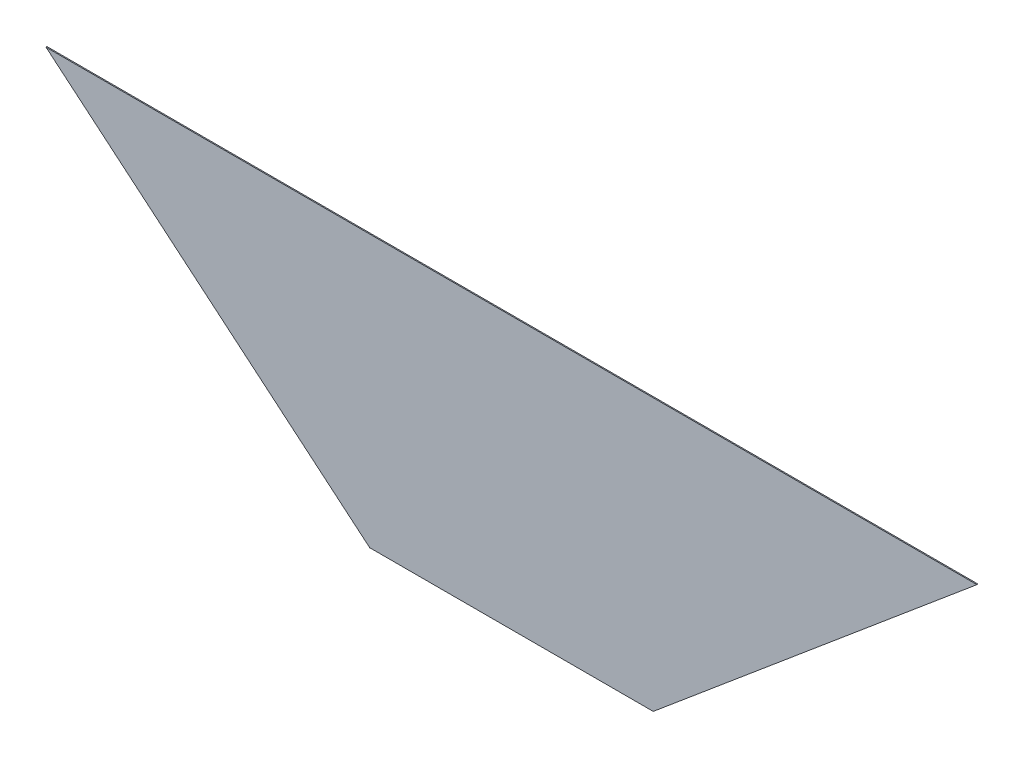
ISO-10303-21;
HEADER;
FILE_DESCRIPTION(('STEP AP214'),'2;1');
FILE_NAME('part.step','',(''),(''),'','','');
FILE_SCHEMA(('AUTOMOTIVE_DESIGN { 1 0 10303 214 1 1 1 1 }'));
ENDSEC;
DATA;
#1=APPLICATION_CONTEXT('core data for automotive mechanical design processes');
#2=APPLICATION_PROTOCOL_DEFINITION('international standard','automotive_design',2000,#1);
#3=PRODUCT_CONTEXT('',#1,'mechanical');
#4=PRODUCT('Part','Part','',(#3));
#5=PRODUCT_RELATED_PRODUCT_CATEGORY('part','',(#4));
#6=PRODUCT_DEFINITION_FORMATION('','',#4);
#7=PRODUCT_DEFINITION_CONTEXT('part definition',#1,'design');
#8=PRODUCT_DEFINITION('design','',#6,#7);
#9=PRODUCT_DEFINITION_SHAPE('','',#8);
#10=(LENGTH_UNIT() NAMED_UNIT(*) SI_UNIT(.MILLI.,.METRE.));
#11=(NAMED_UNIT(*) PLANE_ANGLE_UNIT() SI_UNIT($,.RADIAN.));
#12=(NAMED_UNIT(*) SI_UNIT($,.STERADIAN.) SOLID_ANGLE_UNIT());
#13=UNCERTAINTY_MEASURE_WITH_UNIT(LENGTH_MEASURE(1.E-05),#10,'distance_accuracy_value','');
#14=(GEOMETRIC_REPRESENTATION_CONTEXT(3) GLOBAL_UNCERTAINTY_ASSIGNED_CONTEXT((#13)) GLOBAL_UNIT_ASSIGNED_CONTEXT((#10,
#11,#12)) REPRESENTATION_CONTEXT('',''));
#15=CARTESIAN_POINT('',(0.,0.,0.));
#16=DIRECTION('',(0.,0.,1.));
#17=DIRECTION('',(1.,0.,0.));
#18=AXIS2_PLACEMENT_3D('',#15,#16,#17);
#19=CARTESIAN_POINT('',(0.,0.,2.9));
#20=DIRECTION('',(0.642787609686535,0.766044443118982,0.));
#21=DIRECTION('',(-0.766044443118982,0.642787609686535,0.));
#22=AXIS2_PLACEMENT_3D('',#19,#20,#21);
#23=PLANE('',#22);
#24=DIRECTION('',(0.766044443118982,-0.642787609686535,0.));
#25=VECTOR('',#24,1.);
#26=CARTESIAN_POINT('',(0.,0.,0.));
#27=LINE('',#26,#25);
#28=CARTESIAN_POINT('',(-903.122790003829,757.81,0.));
#29=VERTEX_POINT('',#28);
#30=CARTESIAN_POINT('',(0.,0.,0.));
#31=VERTEX_POINT('',#30);
#32=EDGE_CURVE('E99',#29,#31,#27,.T.);
#33=ORIENTED_EDGE('',*,*,#32,.T.);
#34=DIRECTION('',(0.,0.,-1.));
#35=VECTOR('',#34,1.);
#36=CARTESIAN_POINT('',(0.,0.,2.9));
#37=LINE('',#36,#35);
#38=CARTESIAN_POINT('',(0.,0.,2.9));
#39=VERTEX_POINT('',#38);
#40=EDGE_CURVE('E11',#39,#31,#37,.T.);
#41=ORIENTED_EDGE('',*,*,#40,.F.);
#42=DIRECTION('',(0.766044443118982,-0.642787609686535,0.));
#43=VECTOR('',#42,1.);
#44=CARTESIAN_POINT('',(0.,0.,2.9));
#45=LINE('',#44,#43);
#46=CARTESIAN_POINT('',(-903.122790003829,757.81,2.9));
#47=VERTEX_POINT('',#46);
#48=EDGE_CURVE('E85',#47,#39,#45,.T.);
#49=ORIENTED_EDGE('',*,*,#48,.F.);
#50=DIRECTION('',(0.,0.,-1.));
#51=VECTOR('',#50,1.);
#52=CARTESIAN_POINT('',(-903.122790003829,757.81,2.9));
#53=LINE('',#52,#51);
#54=EDGE_CURVE('E95',#47,#29,#53,.T.);
#55=ORIENTED_EDGE('',*,*,#54,.T.);
#56=EDGE_LOOP('',(#33,#41,#49,#55));
#57=FACE_BOUND('',#56,.T.);
#58=ADVANCED_FACE('F35',(#57),#23,.F.);
#59=CARTESIAN_POINT('',(0.,0.,2.9));
#60=DIRECTION('',(0.,1.,0.));
#61=DIRECTION('',(0.,0.,1.));
#62=AXIS2_PLACEMENT_3D('',#59,#60,#61);
#63=PLANE('',#62);
#64=DIRECTION('',(1.,0.,0.));
#65=VECTOR('',#64,1.);
#66=CARTESIAN_POINT('',(0.,0.,0.));
#67=LINE('',#66,#65);
#68=CARTESIAN_POINT('',(790.88,0.,0.));
#69=VERTEX_POINT('',#68);
#70=EDGE_CURVE('E90',#31,#69,#67,.T.);
#71=ORIENTED_EDGE('',*,*,#70,.T.);
#72=DIRECTION('',(0.,0.,-1.));
#73=VECTOR('',#72,1.);
#74=CARTESIAN_POINT('',(790.88,0.,2.9));
#75=LINE('',#74,#73);
#76=CARTESIAN_POINT('',(790.88,0.,2.9));
#77=VERTEX_POINT('',#76);
#78=EDGE_CURVE('E43',#77,#69,#75,.T.);
#79=ORIENTED_EDGE('',*,*,#78,.F.);
#80=DIRECTION('',(1.,0.,0.));
#81=VECTOR('',#80,1.);
#82=CARTESIAN_POINT('',(0.,0.,2.9));
#83=LINE('',#82,#81);
#84=EDGE_CURVE('E79',#39,#77,#83,.T.);
#85=ORIENTED_EDGE('',*,*,#84,.F.);
#86=ORIENTED_EDGE('',*,*,#40,.T.);
#87=EDGE_LOOP('',(#71,#79,#85,#86));
#88=FACE_BOUND('',#87,.T.);
#89=ADVANCED_FACE('F89',(#88),#63,.F.);
#90=CARTESIAN_POINT('',(790.88,0.,2.9));
#91=DIRECTION('',(-0.64278760968654,0.766044443118977,0.));
#92=DIRECTION('',(-0.766044443118977,-0.64278760968654,0.));
#93=AXIS2_PLACEMENT_3D('',#90,#91,#92);
#94=PLANE('',#93);
#95=DIRECTION('',(0.766044443118977,0.64278760968654,0.));
#96=VECTOR('',#95,1.);
#97=CARTESIAN_POINT('',(790.88,0.,0.));
#98=LINE('',#97,#96);
#99=CARTESIAN_POINT('',(1694.00279000382,757.81,0.));
#100=VERTEX_POINT('',#99);
#101=EDGE_CURVE('E103',#69,#100,#98,.T.);
#102=ORIENTED_EDGE('',*,*,#101,.T.);
#103=DIRECTION('',(0.,0.,-1.));
#104=VECTOR('',#103,1.);
#105=CARTESIAN_POINT('',(1694.00279000382,757.81,2.9));
#106=LINE('',#105,#104);
#107=CARTESIAN_POINT('',(1694.00279000382,757.81,2.9));
#108=VERTEX_POINT('',#107);
#109=EDGE_CURVE('E92',#108,#100,#106,.T.);
#110=ORIENTED_EDGE('',*,*,#109,.F.);
#111=DIRECTION('',(0.766044443118977,0.64278760968654,0.));
#112=VECTOR('',#111,1.);
#113=CARTESIAN_POINT('',(790.88,0.,2.9));
#114=LINE('',#113,#112);
#115=EDGE_CURVE('E82',#77,#108,#114,.T.);
#116=ORIENTED_EDGE('',*,*,#115,.F.);
#117=ORIENTED_EDGE('',*,*,#78,.T.);
#118=EDGE_LOOP('',(#102,#110,#116,#117));
#119=FACE_BOUND('',#118,.T.);
#120=ADVANCED_FACE('F93',(#119),#94,.F.);
#121=CARTESIAN_POINT('',(395.44,757.81,2.9));
#122=DIRECTION('',(0.,-1.,0.));
#123=DIRECTION('',(1.,0.,0.));
#124=AXIS2_PLACEMENT_3D('',#121,#122,#123);
#125=PLANE('',#124);
#126=DIRECTION('',(-1.,0.,0.));
#127=VECTOR('',#126,1.);
#128=CARTESIAN_POINT('',(395.44,757.81,0.));
#129=LINE('',#128,#127);
#130=EDGE_CURVE('E68',#100,#29,#129,.T.);
#131=ORIENTED_EDGE('',*,*,#130,.T.);
#132=ORIENTED_EDGE('',*,*,#54,.F.);
#133=DIRECTION('',(-1.,0.,0.));
#134=VECTOR('',#133,1.);
#135=CARTESIAN_POINT('',(395.44,757.81,2.9));
#136=LINE('',#135,#134);
#137=EDGE_CURVE('E51',#108,#47,#136,.T.);
#138=ORIENTED_EDGE('',*,*,#137,.F.);
#139=ORIENTED_EDGE('',*,*,#109,.T.);
#140=EDGE_LOOP('',(#131,#132,#138,#139));
#141=FACE_BOUND('',#140,.T.);
#142=ADVANCED_FACE('F107',(#141),#125,.F.);
#143=CARTESIAN_POINT('',(0.,0.,2.9));
#144=DIRECTION('',(0.,0.,-1.));
#145=DIRECTION('',(-1.,0.,0.));
#146=AXIS2_PLACEMENT_3D('',#143,#144,#145);
#147=PLANE('',#146);
#148=ORIENTED_EDGE('',*,*,#48,.T.);
#149=ORIENTED_EDGE('',*,*,#84,.T.);
#150=ORIENTED_EDGE('',*,*,#115,.T.);
#151=ORIENTED_EDGE('',*,*,#137,.T.);
#152=EDGE_LOOP('',(#148,#149,#150,#151));
#153=FACE_BOUND('',#152,.T.);
#154=ADVANCED_FACE('F80',(#153),#147,.F.);
#155=CARTESIAN_POINT('',(0.,0.,0.));
#156=DIRECTION('',(0.,0.,-1.));
#157=DIRECTION('',(-1.,0.,0.));
#158=AXIS2_PLACEMENT_3D('',#155,#156,#157);
#159=PLANE('',#158);
#160=ORIENTED_EDGE('',*,*,#32,.F.);
#161=ORIENTED_EDGE('',*,*,#130,.F.);
#162=ORIENTED_EDGE('',*,*,#101,.F.);
#163=ORIENTED_EDGE('',*,*,#70,.F.);
#164=EDGE_LOOP('',(#160,#161,#162,#163));
#165=FACE_BOUND('',#164,.T.);
#166=ADVANCED_FACE('F109',(#165),#159,.T.);
#167=CLOSED_SHELL('',(#58,#89,#120,#142,#154,#166));
#168=MANIFOLD_SOLID_BREP('B2',#167);
#169=ADVANCED_BREP_SHAPE_REPRESENTATION('',(#18,#168),#14);
#170=SHAPE_DEFINITION_REPRESENTATION(#9,#169);
ENDSEC;
END-ISO-10303-21;
